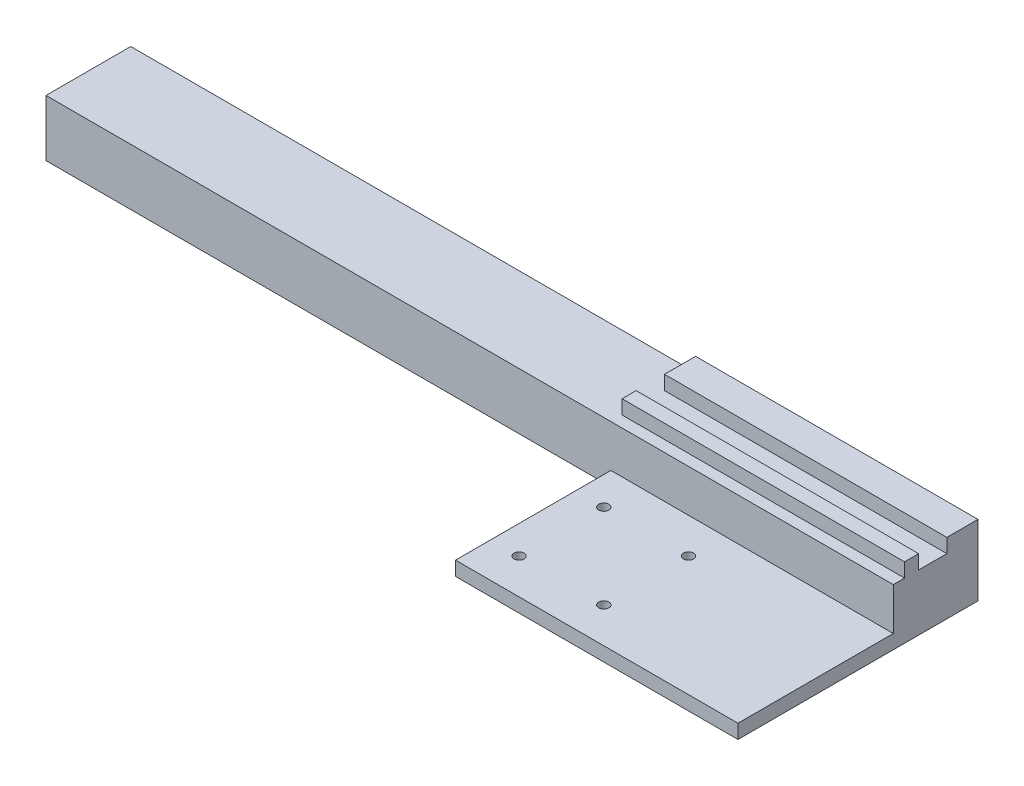
ISO-10303-21;
HEADER;
FILE_DESCRIPTION(('STEP AP214'),'2;1');
FILE_NAME('part.step','',(''),(''),'','','');
FILE_SCHEMA(('AUTOMOTIVE_DESIGN { 1 0 10303 214 1 1 1 1 }'));
ENDSEC;
DATA;
#1=APPLICATION_CONTEXT('core data for automotive mechanical design processes');
#2=APPLICATION_PROTOCOL_DEFINITION('international standard','automotive_design',2000,#1);
#3=PRODUCT_CONTEXT('',#1,'mechanical');
#4=PRODUCT('Part','Part','',(#3));
#5=PRODUCT_RELATED_PRODUCT_CATEGORY('part','',(#4));
#6=PRODUCT_DEFINITION_FORMATION('','',#4);
#7=PRODUCT_DEFINITION_CONTEXT('part definition',#1,'design');
#8=PRODUCT_DEFINITION('design','',#6,#7);
#9=PRODUCT_DEFINITION_SHAPE('','',#8);
#10=(LENGTH_UNIT() NAMED_UNIT(*) SI_UNIT(.MILLI.,.METRE.));
#11=(NAMED_UNIT(*) PLANE_ANGLE_UNIT() SI_UNIT($,.RADIAN.));
#12=(NAMED_UNIT(*) SI_UNIT($,.STERADIAN.) SOLID_ANGLE_UNIT());
#13=UNCERTAINTY_MEASURE_WITH_UNIT(LENGTH_MEASURE(1.E-05),#10,'distance_accuracy_value','');
#14=(GEOMETRIC_REPRESENTATION_CONTEXT(3) GLOBAL_UNCERTAINTY_ASSIGNED_CONTEXT((#13)) GLOBAL_UNIT_ASSIGNED_CONTEXT((#10,
#11,#12)) REPRESENTATION_CONTEXT('',''));
#15=CARTESIAN_POINT('',(0.,0.,0.));
#16=DIRECTION('',(0.,0.,1.));
#17=DIRECTION('',(1.,0.,0.));
#18=AXIS2_PLACEMENT_3D('',#15,#16,#17);
#19=CARTESIAN_POINT('',(0.,20.,0.));
#20=DIRECTION('',(0.,1.,0.));
#21=DIRECTION('',(0.,0.,1.));
#22=AXIS2_PLACEMENT_3D('',#19,#20,#21);
#23=PLANE('',#22);
#24=DIRECTION('',(0.,0.,-1.));
#25=VECTOR('',#24,1.);
#26=CARTESIAN_POINT('',(100.,20.,0.));
#27=LINE('',#26,#25);
#28=CARTESIAN_POINT('',(100.,20.,0.));
#29=VERTEX_POINT('',#28);
#30=CARTESIAN_POINT('',(100.,20.,-3.98000000000002));
#31=VERTEX_POINT('',#30);
#32=EDGE_CURVE('E225',#29,#31,#27,.T.);
#33=ORIENTED_EDGE('',*,*,#32,.T.);
#34=DIRECTION('',(1.,0.,0.));
#35=VECTOR('',#34,1.);
#36=CARTESIAN_POINT('',(0.,20.,-3.98000000000002));
#37=LINE('',#36,#35);
#38=CARTESIAN_POINT('',(0.,20.,-3.98000000000002));
#39=VERTEX_POINT('',#38);
#40=EDGE_CURVE('E156',#39,#31,#37,.T.);
#41=ORIENTED_EDGE('',*,*,#40,.F.);
#42=DIRECTION('',(0.,0.,1.));
#43=VECTOR('',#42,1.);
#44=CARTESIAN_POINT('',(0.,20.,-8.98000000000002));
#45=LINE('',#44,#43);
#46=CARTESIAN_POINT('',(0.,20.,-8.98000000000002));
#47=VERTEX_POINT('',#46);
#48=EDGE_CURVE('E163',#47,#39,#45,.T.);
#49=ORIENTED_EDGE('',*,*,#48,.F.);
#50=DIRECTION('',(-1.,0.,0.));
#51=VECTOR('',#50,1.);
#52=CARTESIAN_POINT('',(0.,20.,-8.98000000000002));
#53=LINE('',#52,#51);
#54=CARTESIAN_POINT('',(100.,20.,-8.98000000000002));
#55=VERTEX_POINT('',#54);
#56=EDGE_CURVE('E148',#55,#47,#53,.T.);
#57=ORIENTED_EDGE('',*,*,#56,.F.);
#58=CARTESIAN_POINT('',(100.,20.,-18.98));
#59=VERTEX_POINT('',#58);
#60=EDGE_CURVE('E224',#55,#59,#27,.T.);
#61=ORIENTED_EDGE('',*,*,#60,.T.);
#62=DIRECTION('',(1.,0.,0.));
#63=VECTOR('',#62,1.);
#64=CARTESIAN_POINT('',(0.,20.,-18.98));
#65=LINE('',#64,#63);
#66=CARTESIAN_POINT('',(0.,20.,-18.98));
#67=VERTEX_POINT('',#66);
#68=EDGE_CURVE('E71',#67,#59,#65,.T.);
#69=ORIENTED_EDGE('',*,*,#68,.F.);
#70=DIRECTION('',(0.,0.,1.));
#71=VECTOR('',#70,1.);
#72=CARTESIAN_POINT('',(0.,20.,-30.));
#73=LINE('',#72,#71);
#74=CARTESIAN_POINT('',(0.,20.,-30.));
#75=VERTEX_POINT('',#74);
#76=EDGE_CURVE('E171',#75,#67,#73,.T.);
#77=ORIENTED_EDGE('',*,*,#76,.F.);
#78=DIRECTION('',(-1.,0.,0.));
#79=VECTOR('',#78,1.);
#80=CARTESIAN_POINT('',(0.,20.,-30.));
#81=LINE('',#80,#79);
#82=CARTESIAN_POINT('',(-200.,20.,-30.));
#83=VERTEX_POINT('',#82);
#84=EDGE_CURVE('E228',#75,#83,#81,.T.);
#85=ORIENTED_EDGE('',*,*,#84,.T.);
#86=DIRECTION('',(0.,0.,-1.));
#87=VECTOR('',#86,1.);
#88=CARTESIAN_POINT('',(-200.,20.,0.));
#89=LINE('',#88,#87);
#90=CARTESIAN_POINT('',(-200.,20.,0.));
#91=VERTEX_POINT('',#90);
#92=EDGE_CURVE('E216',#91,#83,#89,.T.);
#93=ORIENTED_EDGE('',*,*,#92,.F.);
#94=DIRECTION('',(-1.,0.,0.));
#95=VECTOR('',#94,1.);
#96=CARTESIAN_POINT('',(0.,20.,0.));
#97=LINE('',#96,#95);
#98=EDGE_CURVE('E220',#29,#91,#97,.T.);
#99=ORIENTED_EDGE('',*,*,#98,.F.);
#100=EDGE_LOOP('',(#33,#41,#49,#57,#61,#69,#77,#85,#93,#99));
#101=FACE_BOUND('',#100,.T.);
#102=ADVANCED_FACE('F47',(#101),#23,.T.);
#103=CARTESIAN_POINT('',(0.,0.,0.));
#104=DIRECTION('',(0.,1.,0.));
#105=DIRECTION('',(0.,0.,1.));
#106=AXIS2_PLACEMENT_3D('',#103,#104,#105);
#107=PLANE('',#106);
#108=CARTESIAN_POINT('',(40.,0.,42.5));
#109=DIRECTION('',(0.,-1.,0.));
#110=DIRECTION('',(0.,0.,-1.));
#111=AXIS2_PLACEMENT_3D('',#108,#109,#110);
#112=CIRCLE('',#111,3.5);
#113=CARTESIAN_POINT('',(40.,0.,39.));
#114=VERTEX_POINT('',#113);
#115=EDGE_CURVE('E241',#114,#114,#112,.T.);
#116=ORIENTED_EDGE('',*,*,#115,.F.);
#117=EDGE_LOOP('',(#116));
#118=FACE_BOUND('',#117,.T.);
#119=CARTESIAN_POINT('',(10.,0.,42.5));
#120=DIRECTION('',(0.,-1.,0.));
#121=DIRECTION('',(0.,0.,-1.));
#122=AXIS2_PLACEMENT_3D('',#119,#120,#121);
#123=CIRCLE('',#122,3.5);
#124=CARTESIAN_POINT('',(10.,0.,39.));
#125=VERTEX_POINT('',#124);
#126=EDGE_CURVE('E271',#125,#125,#123,.T.);
#127=ORIENTED_EDGE('',*,*,#126,.F.);
#128=EDGE_LOOP('',(#127));
#129=FACE_BOUND('',#128,.T.);
#130=CARTESIAN_POINT('',(10.,0.,12.5));
#131=DIRECTION('',(0.,-1.,0.));
#132=DIRECTION('',(0.,0.,-1.));
#133=AXIS2_PLACEMENT_3D('',#130,#131,#132);
#134=CIRCLE('',#133,3.5);
#135=CARTESIAN_POINT('',(10.,0.,9.));
#136=VERTEX_POINT('',#135);
#137=EDGE_CURVE('E303',#136,#136,#134,.T.);
#138=ORIENTED_EDGE('',*,*,#137,.F.);
#139=EDGE_LOOP('',(#138));
#140=FACE_BOUND('',#139,.T.);
#141=DIRECTION('',(0.,0.,1.));
#142=VECTOR('',#141,1.);
#143=CARTESIAN_POINT('',(0.,0.,0.));
#144=LINE('',#143,#142);
#145=CARTESIAN_POINT('',(0.,0.,0.));
#146=VERTEX_POINT('',#145);
#147=CARTESIAN_POINT('',(0.,0.,55.));
#148=VERTEX_POINT('',#147);
#149=EDGE_CURVE('E319',#146,#148,#144,.T.);
#150=ORIENTED_EDGE('',*,*,#149,.F.);
#151=DIRECTION('',(1.,0.,0.));
#152=VECTOR('',#151,1.);
#153=CARTESIAN_POINT('',(0.,0.,0.));
#154=LINE('',#153,#152);
#155=CARTESIAN_POINT('',(-200.,0.,0.));
#156=VERTEX_POINT('',#155);
#157=EDGE_CURVE('E237',#156,#146,#154,.T.);
#158=ORIENTED_EDGE('',*,*,#157,.F.);
#159=DIRECTION('',(0.,0.,1.));
#160=VECTOR('',#159,1.);
#161=CARTESIAN_POINT('',(-200.,0.,0.));
#162=LINE('',#161,#160);
#163=CARTESIAN_POINT('',(-200.,0.,-30.));
#164=VERTEX_POINT('',#163);
#165=EDGE_CURVE('E236',#164,#156,#162,.T.);
#166=ORIENTED_EDGE('',*,*,#165,.F.);
#167=DIRECTION('',(1.,0.,0.));
#168=VECTOR('',#167,1.);
#169=CARTESIAN_POINT('',(0.,0.,-30.));
#170=LINE('',#169,#168);
#171=CARTESIAN_POINT('',(100.,0.,-30.));
#172=VERTEX_POINT('',#171);
#173=EDGE_CURVE('E232',#164,#172,#170,.T.);
#174=ORIENTED_EDGE('',*,*,#173,.T.);
#175=DIRECTION('',(0.,0.,-1.));
#176=VECTOR('',#175,1.);
#177=CARTESIAN_POINT('',(100.,0.,0.));
#178=LINE('',#177,#176);
#179=CARTESIAN_POINT('',(100.,0.,55.));
#180=VERTEX_POINT('',#179);
#181=EDGE_CURVE('E325',#180,#172,#178,.T.);
#182=ORIENTED_EDGE('',*,*,#181,.F.);
#183=DIRECTION('',(1.,0.,0.));
#184=VECTOR('',#183,1.);
#185=CARTESIAN_POINT('',(0.,0.,55.));
#186=LINE('',#185,#184);
#187=EDGE_CURVE('E340',#148,#180,#186,.T.);
#188=ORIENTED_EDGE('',*,*,#187,.F.);
#189=EDGE_LOOP('',(#150,#158,#166,#174,#182,#188));
#190=FACE_BOUND('',#189,.T.);
#191=CARTESIAN_POINT('',(40.,0.,12.5));
#192=DIRECTION('',(0.,-1.,0.));
#193=DIRECTION('',(0.,0.,-1.));
#194=AXIS2_PLACEMENT_3D('',#191,#192,#193);
#195=CIRCLE('',#194,3.5);
#196=CARTESIAN_POINT('',(40.,0.,9.));
#197=VERTEX_POINT('',#196);
#198=EDGE_CURVE('E287',#197,#197,#195,.T.);
#199=ORIENTED_EDGE('',*,*,#198,.F.);
#200=EDGE_LOOP('',(#199));
#201=FACE_BOUND('',#200,.T.);
#202=ADVANCED_FACE('F358',(#118,#129,#140,#190,#201),#107,.F.);
#203=CARTESIAN_POINT('',(0.,5.,0.));
#204=DIRECTION('',(1.,0.,0.));
#205=DIRECTION('',(0.,0.,-1.));
#206=AXIS2_PLACEMENT_3D('',#203,#204,#205);
#207=PLANE('',#206);
#208=ORIENTED_EDGE('',*,*,#149,.T.);
#209=DIRECTION('',(0.,-1.,0.));
#210=VECTOR('',#209,1.);
#211=CARTESIAN_POINT('',(0.,5.,55.));
#212=LINE('',#211,#210);
#213=CARTESIAN_POINT('',(0.,5.,55.));
#214=VERTEX_POINT('',#213);
#215=EDGE_CURVE('E11',#214,#148,#212,.T.);
#216=ORIENTED_EDGE('',*,*,#215,.F.);
#217=DIRECTION('',(0.,0.,1.));
#218=VECTOR('',#217,1.);
#219=CARTESIAN_POINT('',(0.,5.,0.));
#220=LINE('',#219,#218);
#221=CARTESIAN_POINT('',(0.,5.,0.));
#222=VERTEX_POINT('',#221);
#223=EDGE_CURVE('E320',#222,#214,#220,.T.);
#224=ORIENTED_EDGE('',*,*,#223,.F.);
#225=DIRECTION('',(0.,-1.,0.));
#226=VECTOR('',#225,1.);
#227=CARTESIAN_POINT('',(0.,5.,0.));
#228=LINE('',#227,#226);
#229=EDGE_CURVE('E336',#222,#146,#228,.T.);
#230=ORIENTED_EDGE('',*,*,#229,.T.);
#231=EDGE_LOOP('',(#208,#216,#224,#230));
#232=FACE_BOUND('',#231,.T.);
#233=ADVANCED_FACE('F49',(#232),#207,.F.);
#234=CARTESIAN_POINT('',(0.,5.,55.));
#235=DIRECTION('',(0.,0.,-1.));
#236=DIRECTION('',(-1.,0.,0.));
#237=AXIS2_PLACEMENT_3D('',#234,#235,#236);
#238=PLANE('',#237);
#239=ORIENTED_EDGE('',*,*,#187,.T.);
#240=DIRECTION('',(0.,-1.,0.));
#241=VECTOR('',#240,1.);
#242=CARTESIAN_POINT('',(100.,5.,55.));
#243=LINE('',#242,#241);
#244=CARTESIAN_POINT('',(100.,5.,55.));
#245=VERTEX_POINT('',#244);
#246=EDGE_CURVE('E56',#245,#180,#243,.T.);
#247=ORIENTED_EDGE('',*,*,#246,.F.);
#248=DIRECTION('',(1.,0.,0.));
#249=VECTOR('',#248,1.);
#250=CARTESIAN_POINT('',(0.,5.,55.));
#251=LINE('',#250,#249);
#252=EDGE_CURVE('E324',#214,#245,#251,.T.);
#253=ORIENTED_EDGE('',*,*,#252,.F.);
#254=ORIENTED_EDGE('',*,*,#215,.T.);
#255=EDGE_LOOP('',(#239,#247,#253,#254));
#256=FACE_BOUND('',#255,.T.);
#257=ADVANCED_FACE('F401',(#256),#238,.F.);
#258=CARTESIAN_POINT('',(100.,5.,0.));
#259=DIRECTION('',(-1.,0.,0.));
#260=DIRECTION('',(0.,0.,1.));
#261=AXIS2_PLACEMENT_3D('',#258,#259,#260);
#262=PLANE('',#261);
#263=ORIENTED_EDGE('',*,*,#181,.T.);
#264=DIRECTION('',(0.,1.,0.));
#265=VECTOR('',#264,1.);
#266=CARTESIAN_POINT('',(100.,-301.496268633627,-30.));
#267=LINE('',#266,#265);
#268=CARTESIAN_POINT('',(100.,25.,-30.));
#269=VERTEX_POINT('',#268);
#270=EDGE_CURVE('E246',#172,#269,#267,.T.);
#271=ORIENTED_EDGE('',*,*,#270,.T.);
#272=DIRECTION('',(0.,0.,-1.));
#273=VECTOR('',#272,1.);
#274=CARTESIAN_POINT('',(100.,25.,-30.));
#275=LINE('',#274,#273);
#276=CARTESIAN_POINT('',(100.,25.,-18.98));
#277=VERTEX_POINT('',#276);
#278=EDGE_CURVE('E196',#277,#269,#275,.T.);
#279=ORIENTED_EDGE('',*,*,#278,.F.);
#280=DIRECTION('',(0.,-1.,0.));
#281=VECTOR('',#280,1.);
#282=CARTESIAN_POINT('',(100.,25.,-18.98));
#283=LINE('',#282,#281);
#284=EDGE_CURVE('E209',#277,#59,#283,.T.);
#285=ORIENTED_EDGE('',*,*,#284,.T.);
#286=ORIENTED_EDGE('',*,*,#60,.F.);
#287=DIRECTION('',(0.,-1.,0.));
#288=VECTOR('',#287,1.);
#289=CARTESIAN_POINT('',(100.,25.,-8.98000000000002));
#290=LINE('',#289,#288);
#291=CARTESIAN_POINT('',(100.,25.,-8.98000000000002));
#292=VERTEX_POINT('',#291);
#293=EDGE_CURVE('E63',#292,#55,#290,.T.);
#294=ORIENTED_EDGE('',*,*,#293,.F.);
#295=DIRECTION('',(0.,0.,-1.));
#296=VECTOR('',#295,1.);
#297=CARTESIAN_POINT('',(100.,25.,-8.98000000000002));
#298=LINE('',#297,#296);
#299=CARTESIAN_POINT('',(100.,25.,-3.98000000000002));
#300=VERTEX_POINT('',#299);
#301=EDGE_CURVE('E181',#300,#292,#298,.T.);
#302=ORIENTED_EDGE('',*,*,#301,.F.);
#303=DIRECTION('',(0.,-1.,0.));
#304=VECTOR('',#303,1.);
#305=CARTESIAN_POINT('',(100.,25.,-3.98000000000002));
#306=LINE('',#305,#304);
#307=EDGE_CURVE('E379',#300,#31,#306,.T.);
#308=ORIENTED_EDGE('',*,*,#307,.T.);
#309=ORIENTED_EDGE('',*,*,#32,.F.);
#310=DIRECTION('',(0.,1.,0.));
#311=VECTOR('',#310,1.);
#312=CARTESIAN_POINT('',(100.,-301.496268633627,0.));
#313=LINE('',#312,#311);
#314=CARTESIAN_POINT('',(100.,5.,0.));
#315=VERTEX_POINT('',#314);
#316=EDGE_CURVE('E249',#315,#29,#313,.T.);
#317=ORIENTED_EDGE('',*,*,#316,.F.);
#318=DIRECTION('',(0.,0.,-1.));
#319=VECTOR('',#318,1.);
#320=CARTESIAN_POINT('',(100.,5.,0.));
#321=LINE('',#320,#319);
#322=EDGE_CURVE('E328',#245,#315,#321,.T.);
#323=ORIENTED_EDGE('',*,*,#322,.F.);
#324=ORIENTED_EDGE('',*,*,#246,.T.);
#325=EDGE_LOOP('',(#263,#271,#279,#285,#286,#294,#302,#308,#309,#317,#323,#324));
#326=FACE_BOUND('',#325,.T.);
#327=ADVANCED_FACE('F353',(#326),#262,.F.);
#328=CARTESIAN_POINT('',(0.,5.,0.));
#329=DIRECTION('',(0.,1.,0.));
#330=DIRECTION('',(0.,0.,1.));
#331=AXIS2_PLACEMENT_3D('',#328,#329,#330);
#332=PLANE('',#331);
#333=CARTESIAN_POINT('',(40.,5.,42.5));
#334=DIRECTION('',(0.,-1.,0.));
#335=DIRECTION('',(0.,0.,-1.));
#336=AXIS2_PLACEMENT_3D('',#333,#334,#335);
#337=CIRCLE('',#336,1.8);
#338=CARTESIAN_POINT('',(40.,5.,40.7));
#339=VERTEX_POINT('',#338);
#340=EDGE_CURVE('E267',#339,#339,#337,.T.);
#341=ORIENTED_EDGE('',*,*,#340,.T.);
#342=EDGE_LOOP('',(#341));
#343=FACE_BOUND('',#342,.T.);
#344=CARTESIAN_POINT('',(10.,5.,42.5));
#345=DIRECTION('',(0.,-1.,0.));
#346=DIRECTION('',(0.,0.,-1.));
#347=AXIS2_PLACEMENT_3D('',#344,#345,#346);
#348=CIRCLE('',#347,1.8);
#349=CARTESIAN_POINT('',(10.,5.,40.7));
#350=VERTEX_POINT('',#349);
#351=EDGE_CURVE('E283',#350,#350,#348,.T.);
#352=ORIENTED_EDGE('',*,*,#351,.T.);
#353=EDGE_LOOP('',(#352));
#354=FACE_BOUND('',#353,.T.);
#355=CARTESIAN_POINT('',(40.,5.,12.5));
#356=DIRECTION('',(0.,-1.,0.));
#357=DIRECTION('',(0.,0.,-1.));
#358=AXIS2_PLACEMENT_3D('',#355,#356,#357);
#359=CIRCLE('',#358,1.8);
#360=CARTESIAN_POINT('',(40.,5.,10.7));
#361=VERTEX_POINT('',#360);
#362=EDGE_CURVE('E299',#361,#361,#359,.T.);
#363=ORIENTED_EDGE('',*,*,#362,.T.);
#364=EDGE_LOOP('',(#363));
#365=FACE_BOUND('',#364,.T.);
#366=CARTESIAN_POINT('',(10.,5.,12.5));
#367=DIRECTION('',(0.,-1.,0.));
#368=DIRECTION('',(0.,0.,-1.));
#369=AXIS2_PLACEMENT_3D('',#366,#367,#368);
#370=CIRCLE('',#369,1.8);
#371=CARTESIAN_POINT('',(10.,5.,10.7));
#372=VERTEX_POINT('',#371);
#373=EDGE_CURVE('E315',#372,#372,#370,.T.);
#374=ORIENTED_EDGE('',*,*,#373,.T.);
#375=EDGE_LOOP('',(#374));
#376=FACE_BOUND('',#375,.T.);
#377=ORIENTED_EDGE('',*,*,#223,.T.);
#378=ORIENTED_EDGE('',*,*,#252,.T.);
#379=ORIENTED_EDGE('',*,*,#322,.T.);
#380=DIRECTION('',(-1.,0.,0.));
#381=VECTOR('',#380,1.);
#382=CARTESIAN_POINT('',(0.,5.,0.));
#383=LINE('',#382,#381);
#384=EDGE_CURVE('E332',#315,#222,#383,.T.);
#385=ORIENTED_EDGE('',*,*,#384,.T.);
#386=EDGE_LOOP('',(#377,#378,#379,#385));
#387=FACE_BOUND('',#386,.T.);
#388=ADVANCED_FACE('F398',(#343,#354,#365,#376,#387),#332,.T.);
#389=CARTESIAN_POINT('',(10.,0.,12.5));
#390=DIRECTION('',(0.,-1.,0.));
#391=DIRECTION('',(0.,0.,-1.));
#392=AXIS2_PLACEMENT_3D('',#389,#390,#391);
#393=CYLINDRICAL_SURFACE('',#392,1.8);
#394=ORIENTED_EDGE('',*,*,#373,.F.);
#395=EDGE_LOOP('',(#394));
#396=FACE_BOUND('',#395,.T.);
#397=CARTESIAN_POINT('',(10.,2.4,12.5));
#398=DIRECTION('',(0.,-1.,0.));
#399=DIRECTION('',(0.,0.,-1.));
#400=AXIS2_PLACEMENT_3D('',#397,#398,#399);
#401=CIRCLE('',#400,1.80000000000001);
#402=CARTESIAN_POINT('',(10.,2.4,10.7));
#403=VERTEX_POINT('',#402);
#404=EDGE_CURVE('E311',#403,#403,#401,.T.);
#405=ORIENTED_EDGE('',*,*,#404,.T.);
#406=EDGE_LOOP('',(#405));
#407=FACE_BOUND('',#406,.T.);
#408=ADVANCED_FACE('F472',(#396,#407),#393,.F.);
#409=CARTESIAN_POINT('',(11.8,2.4,12.5));
#410=DIRECTION('',(0.,1.,0.));
#411=DIRECTION('',(0.,0.,1.));
#412=AXIS2_PLACEMENT_3D('',#409,#410,#411);
#413=PLANE('',#412);
#414=ORIENTED_EDGE('',*,*,#404,.F.);
#415=EDGE_LOOP('',(#414));
#416=FACE_BOUND('',#415,.T.);
#417=CARTESIAN_POINT('',(10.,2.4,12.5));
#418=DIRECTION('',(0.,-1.,0.));
#419=DIRECTION('',(0.,0.,-1.));
#420=AXIS2_PLACEMENT_3D('',#417,#418,#419);
#421=CIRCLE('',#420,3.5);
#422=CARTESIAN_POINT('',(10.,2.4,9.));
#423=VERTEX_POINT('',#422);
#424=EDGE_CURVE('E307',#423,#423,#421,.T.);
#425=ORIENTED_EDGE('',*,*,#424,.T.);
#426=EDGE_LOOP('',(#425));
#427=FACE_BOUND('',#426,.T.);
#428=ADVANCED_FACE('F468',(#416,#427),#413,.F.);
#429=CARTESIAN_POINT('',(10.,0.,12.5));
#430=DIRECTION('',(0.,-1.,0.));
#431=DIRECTION('',(0.,0.,-1.));
#432=AXIS2_PLACEMENT_3D('',#429,#430,#431);
#433=CYLINDRICAL_SURFACE('',#432,3.5);
#434=ORIENTED_EDGE('',*,*,#424,.F.);
#435=EDGE_LOOP('',(#434));
#436=FACE_BOUND('',#435,.T.);
#437=ORIENTED_EDGE('',*,*,#137,.T.);
#438=EDGE_LOOP('',(#437));
#439=FACE_BOUND('',#438,.T.);
#440=ADVANCED_FACE('F464',(#436,#439),#433,.F.);
#441=CARTESIAN_POINT('',(40.,0.,12.5));
#442=DIRECTION('',(0.,-1.,0.));
#443=DIRECTION('',(0.,0.,-1.));
#444=AXIS2_PLACEMENT_3D('',#441,#442,#443);
#445=CYLINDRICAL_SURFACE('',#444,1.8);
#446=ORIENTED_EDGE('',*,*,#362,.F.);
#447=EDGE_LOOP('',(#446));
#448=FACE_BOUND('',#447,.T.);
#449=CARTESIAN_POINT('',(40.,2.4,12.5));
#450=DIRECTION('',(0.,-1.,0.));
#451=DIRECTION('',(0.,0.,-1.));
#452=AXIS2_PLACEMENT_3D('',#449,#450,#451);
#453=CIRCLE('',#452,1.80000000000001);
#454=CARTESIAN_POINT('',(40.,2.4,10.7));
#455=VERTEX_POINT('',#454);
#456=EDGE_CURVE('E295',#455,#455,#453,.T.);
#457=ORIENTED_EDGE('',*,*,#456,.T.);
#458=EDGE_LOOP('',(#457));
#459=FACE_BOUND('',#458,.T.);
#460=ADVANCED_FACE('F460',(#448,#459),#445,.F.);
#461=CARTESIAN_POINT('',(41.8,2.4,12.5));
#462=DIRECTION('',(0.,1.,0.));
#463=DIRECTION('',(0.,0.,1.));
#464=AXIS2_PLACEMENT_3D('',#461,#462,#463);
#465=PLANE('',#464);
#466=ORIENTED_EDGE('',*,*,#456,.F.);
#467=EDGE_LOOP('',(#466));
#468=FACE_BOUND('',#467,.T.);
#469=CARTESIAN_POINT('',(40.,2.4,12.5));
#470=DIRECTION('',(0.,-1.,0.));
#471=DIRECTION('',(0.,0.,-1.));
#472=AXIS2_PLACEMENT_3D('',#469,#470,#471);
#473=CIRCLE('',#472,3.5);
#474=CARTESIAN_POINT('',(40.,2.4,8.99999999999999));
#475=VERTEX_POINT('',#474);
#476=EDGE_CURVE('E291',#475,#475,#473,.T.);
#477=ORIENTED_EDGE('',*,*,#476,.T.);
#478=EDGE_LOOP('',(#477));
#479=FACE_BOUND('',#478,.T.);
#480=ADVANCED_FACE('F456',(#468,#479),#465,.F.);
#481=CARTESIAN_POINT('',(40.,0.,12.5));
#482=DIRECTION('',(0.,-1.,0.));
#483=DIRECTION('',(0.,0.,-1.));
#484=AXIS2_PLACEMENT_3D('',#481,#482,#483);
#485=CYLINDRICAL_SURFACE('',#484,3.5);
#486=ORIENTED_EDGE('',*,*,#476,.F.);
#487=EDGE_LOOP('',(#486));
#488=FACE_BOUND('',#487,.T.);
#489=ORIENTED_EDGE('',*,*,#198,.T.);
#490=EDGE_LOOP('',(#489));
#491=FACE_BOUND('',#490,.T.);
#492=ADVANCED_FACE('F452',(#488,#491),#485,.F.);
#493=CARTESIAN_POINT('',(10.,0.,42.5));
#494=DIRECTION('',(0.,-1.,0.));
#495=DIRECTION('',(0.,0.,-1.));
#496=AXIS2_PLACEMENT_3D('',#493,#494,#495);
#497=CYLINDRICAL_SURFACE('',#496,1.8);
#498=ORIENTED_EDGE('',*,*,#351,.F.);
#499=EDGE_LOOP('',(#498));
#500=FACE_BOUND('',#499,.T.);
#501=CARTESIAN_POINT('',(10.,2.4,42.5));
#502=DIRECTION('',(0.,-1.,0.));
#503=DIRECTION('',(0.,0.,-1.));
#504=AXIS2_PLACEMENT_3D('',#501,#502,#503);
#505=CIRCLE('',#504,1.80000000000001);
#506=CARTESIAN_POINT('',(10.,2.4,40.7));
#507=VERTEX_POINT('',#506);
#508=EDGE_CURVE('E279',#507,#507,#505,.T.);
#509=ORIENTED_EDGE('',*,*,#508,.T.);
#510=EDGE_LOOP('',(#509));
#511=FACE_BOUND('',#510,.T.);
#512=ADVANCED_FACE('F448',(#500,#511),#497,.F.);
#513=CARTESIAN_POINT('',(11.8,2.4,42.5));
#514=DIRECTION('',(0.,1.,0.));
#515=DIRECTION('',(0.,0.,1.));
#516=AXIS2_PLACEMENT_3D('',#513,#514,#515);
#517=PLANE('',#516);
#518=ORIENTED_EDGE('',*,*,#508,.F.);
#519=EDGE_LOOP('',(#518));
#520=FACE_BOUND('',#519,.T.);
#521=CARTESIAN_POINT('',(10.,2.4,42.5));
#522=DIRECTION('',(0.,-1.,0.));
#523=DIRECTION('',(0.,0.,-1.));
#524=AXIS2_PLACEMENT_3D('',#521,#522,#523);
#525=CIRCLE('',#524,3.5);
#526=CARTESIAN_POINT('',(10.,2.4,39.));
#527=VERTEX_POINT('',#526);
#528=EDGE_CURVE('E275',#527,#527,#525,.T.);
#529=ORIENTED_EDGE('',*,*,#528,.T.);
#530=EDGE_LOOP('',(#529));
#531=FACE_BOUND('',#530,.T.);
#532=ADVANCED_FACE('F444',(#520,#531),#517,.F.);
#533=CARTESIAN_POINT('',(10.,0.,42.5));
#534=DIRECTION('',(0.,-1.,0.));
#535=DIRECTION('',(0.,0.,-1.));
#536=AXIS2_PLACEMENT_3D('',#533,#534,#535);
#537=CYLINDRICAL_SURFACE('',#536,3.5);
#538=ORIENTED_EDGE('',*,*,#528,.F.);
#539=EDGE_LOOP('',(#538));
#540=FACE_BOUND('',#539,.T.);
#541=ORIENTED_EDGE('',*,*,#126,.T.);
#542=EDGE_LOOP('',(#541));
#543=FACE_BOUND('',#542,.T.);
#544=ADVANCED_FACE('F440',(#540,#543),#537,.F.);
#545=CARTESIAN_POINT('',(40.,0.,42.5));
#546=DIRECTION('',(0.,-1.,0.));
#547=DIRECTION('',(0.,0.,-1.));
#548=AXIS2_PLACEMENT_3D('',#545,#546,#547);
#549=CYLINDRICAL_SURFACE('',#548,1.8);
#550=ORIENTED_EDGE('',*,*,#340,.F.);
#551=EDGE_LOOP('',(#550));
#552=FACE_BOUND('',#551,.T.);
#553=CARTESIAN_POINT('',(40.,2.4,42.5));
#554=DIRECTION('',(0.,-1.,0.));
#555=DIRECTION('',(0.,0.,-1.));
#556=AXIS2_PLACEMENT_3D('',#553,#554,#555);
#557=CIRCLE('',#556,1.80000000000001);
#558=CARTESIAN_POINT('',(40.,2.4,40.7));
#559=VERTEX_POINT('',#558);
#560=EDGE_CURVE('E263',#559,#559,#557,.T.);
#561=ORIENTED_EDGE('',*,*,#560,.T.);
#562=EDGE_LOOP('',(#561));
#563=FACE_BOUND('',#562,.T.);
#564=ADVANCED_FACE('F436',(#552,#563),#549,.F.);
#565=CARTESIAN_POINT('',(41.8,2.4,42.5));
#566=DIRECTION('',(0.,1.,0.));
#567=DIRECTION('',(0.,0.,1.));
#568=AXIS2_PLACEMENT_3D('',#565,#566,#567);
#569=PLANE('',#568);
#570=ORIENTED_EDGE('',*,*,#560,.F.);
#571=EDGE_LOOP('',(#570));
#572=FACE_BOUND('',#571,.T.);
#573=CARTESIAN_POINT('',(40.,2.4,42.5));
#574=DIRECTION('',(0.,-1.,0.));
#575=DIRECTION('',(0.,0.,-1.));
#576=AXIS2_PLACEMENT_3D('',#573,#574,#575);
#577=CIRCLE('',#576,3.5);
#578=CARTESIAN_POINT('',(40.,2.4,39.));
#579=VERTEX_POINT('',#578);
#580=EDGE_CURVE('E259',#579,#579,#577,.T.);
#581=ORIENTED_EDGE('',*,*,#580,.T.);
#582=EDGE_LOOP('',(#581));
#583=FACE_BOUND('',#582,.T.);
#584=ADVANCED_FACE('F432',(#572,#583),#569,.F.);
#585=CARTESIAN_POINT('',(40.,0.,42.5));
#586=DIRECTION('',(0.,-1.,0.));
#587=DIRECTION('',(0.,0.,-1.));
#588=AXIS2_PLACEMENT_3D('',#585,#586,#587);
#589=CYLINDRICAL_SURFACE('',#588,3.5);
#590=ORIENTED_EDGE('',*,*,#580,.F.);
#591=EDGE_LOOP('',(#590));
#592=FACE_BOUND('',#591,.T.);
#593=ORIENTED_EDGE('',*,*,#115,.T.);
#594=EDGE_LOOP('',(#593));
#595=FACE_BOUND('',#594,.T.);
#596=ADVANCED_FACE('F428',(#592,#595),#589,.F.);
#597=CARTESIAN_POINT('',(0.,-301.496268633627,0.));
#598=DIRECTION('',(0.,0.,-1.));
#599=DIRECTION('',(-1.,0.,0.));
#600=AXIS2_PLACEMENT_3D('',#597,#598,#599);
#601=PLANE('',#600);
#602=ORIENTED_EDGE('',*,*,#229,.F.);
#603=ORIENTED_EDGE('',*,*,#384,.F.);
#604=ORIENTED_EDGE('',*,*,#316,.T.);
#605=ORIENTED_EDGE('',*,*,#98,.T.);
#606=DIRECTION('',(0.,1.,0.));
#607=VECTOR('',#606,1.);
#608=CARTESIAN_POINT('',(-200.,-301.496268633627,0.));
#609=LINE('',#608,#607);
#610=EDGE_CURVE('E231',#156,#91,#609,.T.);
#611=ORIENTED_EDGE('',*,*,#610,.F.);
#612=ORIENTED_EDGE('',*,*,#157,.T.);
#613=EDGE_LOOP('',(#602,#603,#604,#605,#611,#612));
#614=FACE_BOUND('',#613,.T.);
#615=ADVANCED_FACE('F396',(#614),#601,.F.);
#616=CARTESIAN_POINT('',(0.,-301.496268633627,-30.));
#617=DIRECTION('',(0.,0.,-1.));
#618=DIRECTION('',(-1.,0.,0.));
#619=AXIS2_PLACEMENT_3D('',#616,#617,#618);
#620=PLANE('',#619);
#621=ORIENTED_EDGE('',*,*,#173,.F.);
#622=DIRECTION('',(0.,1.,0.));
#623=VECTOR('',#622,1.);
#624=CARTESIAN_POINT('',(-200.,-301.496268633627,-30.));
#625=LINE('',#624,#623);
#626=EDGE_CURVE('E242',#164,#83,#625,.T.);
#627=ORIENTED_EDGE('',*,*,#626,.T.);
#628=ORIENTED_EDGE('',*,*,#84,.F.);
#629=DIRECTION('',(0.,-1.,0.));
#630=VECTOR('',#629,1.);
#631=CARTESIAN_POINT('',(0.,25.,-30.));
#632=LINE('',#631,#630);
#633=CARTESIAN_POINT('',(0.,25.,-30.));
#634=VERTEX_POINT('',#633);
#635=EDGE_CURVE('E202',#634,#75,#632,.T.);
#636=ORIENTED_EDGE('',*,*,#635,.F.);
#637=DIRECTION('',(-1.,0.,0.));
#638=VECTOR('',#637,1.);
#639=CARTESIAN_POINT('',(0.,25.,-30.));
#640=LINE('',#639,#638);
#641=EDGE_CURVE('E200',#269,#634,#640,.T.);
#642=ORIENTED_EDGE('',*,*,#641,.F.);
#643=ORIENTED_EDGE('',*,*,#270,.F.);
#644=EDGE_LOOP('',(#621,#627,#628,#636,#642,#643));
#645=FACE_BOUND('',#644,.T.);
#646=ADVANCED_FACE('F365',(#645),#620,.T.);
#647=CARTESIAN_POINT('',(-200.,-301.496268633627,0.));
#648=DIRECTION('',(1.,0.,0.));
#649=DIRECTION('',(0.,0.,-1.));
#650=AXIS2_PLACEMENT_3D('',#647,#648,#649);
#651=PLANE('',#650);
#652=ORIENTED_EDGE('',*,*,#626,.F.);
#653=ORIENTED_EDGE('',*,*,#165,.T.);
#654=ORIENTED_EDGE('',*,*,#610,.T.);
#655=ORIENTED_EDGE('',*,*,#92,.T.);
#656=EDGE_LOOP('',(#652,#653,#654,#655));
#657=FACE_BOUND('',#656,.T.);
#658=ADVANCED_FACE('F404',(#657),#651,.F.);
#659=CARTESIAN_POINT('',(0.,25.,-30.));
#660=DIRECTION('',(1.,0.,0.));
#661=DIRECTION('',(0.,0.,-1.));
#662=AXIS2_PLACEMENT_3D('',#659,#660,#661);
#663=PLANE('',#662);
#664=ORIENTED_EDGE('',*,*,#76,.T.);
#665=DIRECTION('',(0.,-1.,0.));
#666=VECTOR('',#665,1.);
#667=CARTESIAN_POINT('',(0.,25.,-18.98));
#668=LINE('',#667,#666);
#669=CARTESIAN_POINT('',(0.,25.,-18.98));
#670=VERTEX_POINT('',#669);
#671=EDGE_CURVE('E213',#670,#67,#668,.T.);
#672=ORIENTED_EDGE('',*,*,#671,.F.);
#673=DIRECTION('',(0.,0.,1.));
#674=VECTOR('',#673,1.);
#675=CARTESIAN_POINT('',(0.,25.,-30.));
#676=LINE('',#675,#674);
#677=EDGE_CURVE('E189',#634,#670,#676,.T.);
#678=ORIENTED_EDGE('',*,*,#677,.F.);
#679=ORIENTED_EDGE('',*,*,#635,.T.);
#680=EDGE_LOOP('',(#664,#672,#678,#679));
#681=FACE_BOUND('',#680,.T.);
#682=ADVANCED_FACE('F407',(#681),#663,.F.);
#683=CARTESIAN_POINT('',(0.,25.,-18.98));
#684=DIRECTION('',(0.,0.,-1.));
#685=DIRECTION('',(-1.,0.,0.));
#686=AXIS2_PLACEMENT_3D('',#683,#684,#685);
#687=PLANE('',#686);
#688=ORIENTED_EDGE('',*,*,#68,.T.);
#689=ORIENTED_EDGE('',*,*,#284,.F.);
#690=DIRECTION('',(1.,0.,0.));
#691=VECTOR('',#690,1.);
#692=CARTESIAN_POINT('',(0.,25.,-18.98));
#693=LINE('',#692,#691);
#694=EDGE_CURVE('E193',#670,#277,#693,.T.);
#695=ORIENTED_EDGE('',*,*,#694,.F.);
#696=ORIENTED_EDGE('',*,*,#671,.T.);
#697=EDGE_LOOP('',(#688,#689,#695,#696));
#698=FACE_BOUND('',#697,.T.);
#699=ADVANCED_FACE('F374',(#698),#687,.F.);
#700=CARTESIAN_POINT('',(0.,25.,0.));
#701=DIRECTION('',(0.,1.,0.));
#702=DIRECTION('',(0.,0.,1.));
#703=AXIS2_PLACEMENT_3D('',#700,#701,#702);
#704=PLANE('',#703);
#705=ORIENTED_EDGE('',*,*,#677,.T.);
#706=ORIENTED_EDGE('',*,*,#694,.T.);
#707=ORIENTED_EDGE('',*,*,#278,.T.);
#708=ORIENTED_EDGE('',*,*,#641,.T.);
#709=EDGE_LOOP('',(#705,#706,#707,#708));
#710=FACE_BOUND('',#709,.T.);
#711=ADVANCED_FACE('F369',(#710),#704,.T.);
#712=CARTESIAN_POINT('',(0.,25.,-8.98000000000002));
#713=DIRECTION('',(1.,0.,0.));
#714=DIRECTION('',(0.,0.,-1.));
#715=AXIS2_PLACEMENT_3D('',#712,#713,#714);
#716=PLANE('',#715);
#717=ORIENTED_EDGE('',*,*,#48,.T.);
#718=DIRECTION('',(0.,-1.,0.));
#719=VECTOR('',#718,1.);
#720=CARTESIAN_POINT('',(0.,25.,-3.98000000000002));
#721=LINE('',#720,#719);
#722=CARTESIAN_POINT('',(0.,25.,-3.98000000000002));
#723=VERTEX_POINT('',#722);
#724=EDGE_CURVE('E388',#723,#39,#721,.T.);
#725=ORIENTED_EDGE('',*,*,#724,.F.);
#726=DIRECTION('',(0.,0.,1.));
#727=VECTOR('',#726,1.);
#728=CARTESIAN_POINT('',(0.,25.,-8.98000000000002));
#729=LINE('',#728,#727);
#730=CARTESIAN_POINT('',(0.,25.,-8.98000000000002));
#731=VERTEX_POINT('',#730);
#732=EDGE_CURVE('E157',#731,#723,#729,.T.);
#733=ORIENTED_EDGE('',*,*,#732,.F.);
#734=DIRECTION('',(0.,-1.,0.));
#735=VECTOR('',#734,1.);
#736=CARTESIAN_POINT('',(0.,25.,-8.98000000000002));
#737=LINE('',#736,#735);
#738=EDGE_CURVE('E151',#731,#47,#737,.T.);
#739=ORIENTED_EDGE('',*,*,#738,.T.);
#740=EDGE_LOOP('',(#717,#725,#733,#739));
#741=FACE_BOUND('',#740,.T.);
#742=ADVANCED_FACE('F161',(#741),#716,.F.);
#743=CARTESIAN_POINT('',(0.,25.,-3.98000000000002));
#744=DIRECTION('',(0.,0.,-1.));
#745=DIRECTION('',(-1.,0.,0.));
#746=AXIS2_PLACEMENT_3D('',#743,#744,#745);
#747=PLANE('',#746);
#748=ORIENTED_EDGE('',*,*,#40,.T.);
#749=ORIENTED_EDGE('',*,*,#307,.F.);
#750=DIRECTION('',(1.,0.,0.));
#751=VECTOR('',#750,1.);
#752=CARTESIAN_POINT('',(0.,25.,-3.98000000000002));
#753=LINE('',#752,#751);
#754=EDGE_CURVE('E184',#723,#300,#753,.T.);
#755=ORIENTED_EDGE('',*,*,#754,.F.);
#756=ORIENTED_EDGE('',*,*,#724,.T.);
#757=EDGE_LOOP('',(#748,#749,#755,#756));
#758=FACE_BOUND('',#757,.T.);
#759=ADVANCED_FACE('F385',(#758),#747,.F.);
#760=CARTESIAN_POINT('',(0.,25.,-8.98000000000002));
#761=DIRECTION('',(0.,0.,1.));
#762=DIRECTION('',(1.,0.,0.));
#763=AXIS2_PLACEMENT_3D('',#760,#761,#762);
#764=PLANE('',#763);
#765=ORIENTED_EDGE('',*,*,#56,.T.);
#766=ORIENTED_EDGE('',*,*,#738,.F.);
#767=DIRECTION('',(-1.,0.,0.));
#768=VECTOR('',#767,1.);
#769=CARTESIAN_POINT('',(0.,25.,-8.98000000000002));
#770=LINE('',#769,#768);
#771=EDGE_CURVE('E167',#292,#731,#770,.T.);
#772=ORIENTED_EDGE('',*,*,#771,.F.);
#773=ORIENTED_EDGE('',*,*,#293,.T.);
#774=EDGE_LOOP('',(#765,#766,#772,#773));
#775=FACE_BOUND('',#774,.T.);
#776=ADVANCED_FACE('F150',(#775),#764,.F.);
#777=CARTESIAN_POINT('',(0.,25.,0.));
#778=DIRECTION('',(0.,1.,0.));
#779=DIRECTION('',(0.,0.,1.));
#780=AXIS2_PLACEMENT_3D('',#777,#778,#779);
#781=PLANE('',#780);
#782=ORIENTED_EDGE('',*,*,#732,.T.);
#783=ORIENTED_EDGE('',*,*,#754,.T.);
#784=ORIENTED_EDGE('',*,*,#301,.T.);
#785=ORIENTED_EDGE('',*,*,#771,.T.);
#786=EDGE_LOOP('',(#782,#783,#784,#785));
#787=FACE_BOUND('',#786,.T.);
#788=ADVANCED_FACE('F382',(#787),#781,.T.);
#789=CLOSED_SHELL('',(#102,#202,#233,#257,#327,#388,#408,#428,#440,#460,#480,#492,#512,#532,
#544,#564,#584,#596,#615,#646,#658,#682,#699,#711,#742,#759,#776,#788));
#790=MANIFOLD_SOLID_BREP('B2',#789);
#791=ADVANCED_BREP_SHAPE_REPRESENTATION('',(#18,#790),#14);
#792=SHAPE_DEFINITION_REPRESENTATION(#9,#791);
ENDSEC;
END-ISO-10303-21;
